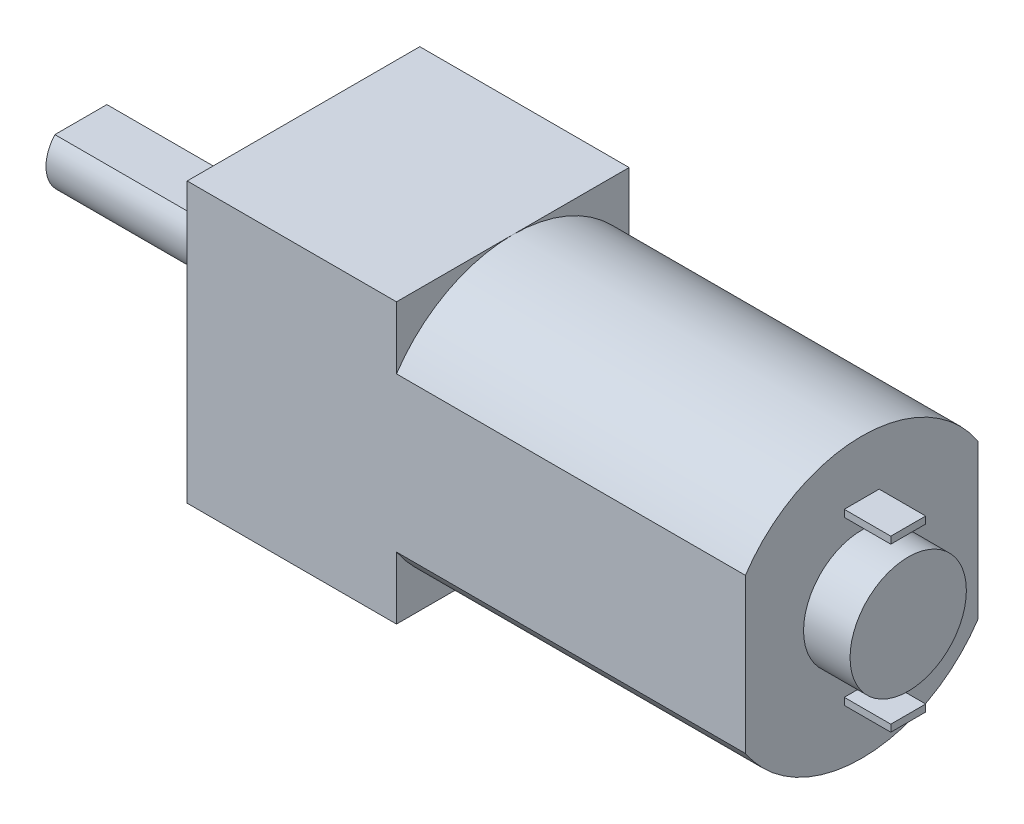
ISO-10303-21;
HEADER;
FILE_DESCRIPTION(('STEP AP214'),'2;1');
FILE_NAME('part.step','',(''),(''),'','','');
FILE_SCHEMA(('AUTOMOTIVE_DESIGN { 1 0 10303 214 1 1 1 1 }'));
ENDSEC;
DATA;
#1=APPLICATION_CONTEXT('core data for automotive mechanical design processes');
#2=APPLICATION_PROTOCOL_DEFINITION('international standard','automotive_design',2000,#1);
#3=PRODUCT_CONTEXT('',#1,'mechanical');
#4=PRODUCT('Part','Part','',(#3));
#5=PRODUCT_RELATED_PRODUCT_CATEGORY('part','',(#4));
#6=PRODUCT_DEFINITION_FORMATION('','',#4);
#7=PRODUCT_DEFINITION_CONTEXT('part definition',#1,'design');
#8=PRODUCT_DEFINITION('design','',#6,#7);
#9=PRODUCT_DEFINITION_SHAPE('','',#8);
#10=(LENGTH_UNIT() NAMED_UNIT(*) SI_UNIT(.MILLI.,.METRE.));
#11=(NAMED_UNIT(*) PLANE_ANGLE_UNIT() SI_UNIT($,.RADIAN.));
#12=(NAMED_UNIT(*) SI_UNIT($,.STERADIAN.) SOLID_ANGLE_UNIT());
#13=UNCERTAINTY_MEASURE_WITH_UNIT(LENGTH_MEASURE(1.E-05),#10,'distance_accuracy_value','');
#14=(GEOMETRIC_REPRESENTATION_CONTEXT(3) GLOBAL_UNCERTAINTY_ASSIGNED_CONTEXT((#13)) GLOBAL_UNIT_ASSIGNED_CONTEXT((#10,
#11,#12)) REPRESENTATION_CONTEXT('',''));
#15=CARTESIAN_POINT('',(0.,0.,0.));
#16=DIRECTION('',(0.,0.,1.));
#17=DIRECTION('',(1.,0.,0.));
#18=AXIS2_PLACEMENT_3D('',#15,#16,#17);
#19=CARTESIAN_POINT('',(15.,0.,0.));
#20=DIRECTION('',(-1.,0.,0.));
#21=DIRECTION('',(0.,0.,1.));
#22=AXIS2_PLACEMENT_3D('',#19,#20,#21);
#23=PLANE('',#22);
#24=DIRECTION('',(0.,1.,0.));
#25=VECTOR('',#24,1.);
#26=CARTESIAN_POINT('',(15.,-3.35,-0.750000000000003));
#27=LINE('',#26,#25);
#28=CARTESIAN_POINT('',(15.,-3.65,-0.750000000000003));
#29=VERTEX_POINT('',#28);
#30=CARTESIAN_POINT('',(15.,-3.35,-0.750000000000003));
#31=VERTEX_POINT('',#30);
#32=EDGE_CURVE('E181',#29,#31,#27,.T.);
#33=ORIENTED_EDGE('',*,*,#32,.F.);
#34=DIRECTION('',(0.,0.,-1.));
#35=VECTOR('',#34,1.);
#36=CARTESIAN_POINT('',(15.,-3.65,0.749999999999997));
#37=LINE('',#36,#35);
#38=CARTESIAN_POINT('',(15.,-3.65,0.749999999999997));
#39=VERTEX_POINT('',#38);
#40=EDGE_CURVE('E178',#39,#29,#37,.T.);
#41=ORIENTED_EDGE('',*,*,#40,.F.);
#42=DIRECTION('',(0.,-1.,0.));
#43=VECTOR('',#42,1.);
#44=CARTESIAN_POINT('',(15.,-3.35,0.749999999999997));
#45=LINE('',#44,#43);
#46=CARTESIAN_POINT('',(15.,-3.35,0.749999999999997));
#47=VERTEX_POINT('',#46);
#48=EDGE_CURVE('E50',#47,#39,#45,.T.);
#49=ORIENTED_EDGE('',*,*,#48,.F.);
#50=DIRECTION('',(0.,0.,1.));
#51=VECTOR('',#50,1.);
#52=CARTESIAN_POINT('',(15.,-3.35,0.749999999999997));
#53=LINE('',#52,#51);
#54=EDGE_CURVE('E45',#31,#47,#53,.T.);
#55=ORIENTED_EDGE('',*,*,#54,.F.);
#56=EDGE_LOOP('',(#33,#41,#49,#55));
#57=FACE_BOUND('',#56,.T.);
#58=CARTESIAN_POINT('',(15.,0.,0.));
#59=DIRECTION('',(-1.,0.,0.));
#60=DIRECTION('',(0.,0.,1.));
#61=AXIS2_PLACEMENT_3D('',#58,#59,#60);
#62=CIRCLE('',#61,6.);
#63=CARTESIAN_POINT('',(15.,-3.3166247903554,-5.));
#64=VERTEX_POINT('',#63);
#65=CARTESIAN_POINT('',(15.,-3.3166247903554,5.));
#66=VERTEX_POINT('',#65);
#67=EDGE_CURVE('E290',#64,#66,#62,.T.);
#68=ORIENTED_EDGE('',*,*,#67,.F.);
#69=DIRECTION('',(0.,1.,0.));
#70=VECTOR('',#69,1.);
#71=CARTESIAN_POINT('',(15.,-6.,-5.));
#72=LINE('',#71,#70);
#73=CARTESIAN_POINT('',(15.,3.3166247903554,-5.));
#74=VERTEX_POINT('',#73);
#75=EDGE_CURVE('E238',#64,#74,#72,.T.);
#76=ORIENTED_EDGE('',*,*,#75,.T.);
#77=CARTESIAN_POINT('',(15.,3.3166247903554,5.));
#78=VERTEX_POINT('',#77);
#79=EDGE_CURVE('E291',#78,#74,#62,.T.);
#80=ORIENTED_EDGE('',*,*,#79,.F.);
#81=DIRECTION('',(0.,-1.,0.));
#82=VECTOR('',#81,1.);
#83=CARTESIAN_POINT('',(15.,-6.,5.));
#84=LINE('',#83,#82);
#85=EDGE_CURVE('E245',#78,#66,#84,.T.);
#86=ORIENTED_EDGE('',*,*,#85,.T.);
#87=EDGE_LOOP('',(#68,#76,#80,#86));
#88=FACE_BOUND('',#87,.T.);
#89=DIRECTION('',(0.,1.,0.));
#90=VECTOR('',#89,1.);
#91=CARTESIAN_POINT('',(15.,3.65,-0.750000000000001));
#92=LINE('',#91,#90);
#93=CARTESIAN_POINT('',(15.,3.35,-0.750000000000001));
#94=VERTEX_POINT('',#93);
#95=CARTESIAN_POINT('',(15.,3.65,-0.750000000000001));
#96=VERTEX_POINT('',#95);
#97=EDGE_CURVE('E182',#94,#96,#92,.T.);
#98=ORIENTED_EDGE('',*,*,#97,.F.);
#99=DIRECTION('',(0.,0.,-1.));
#100=VECTOR('',#99,1.);
#101=CARTESIAN_POINT('',(15.,3.35,0.749999999999999));
#102=LINE('',#101,#100);
#103=CARTESIAN_POINT('',(15.,3.35,0.749999999999999));
#104=VERTEX_POINT('',#103);
#105=EDGE_CURVE('E195',#104,#94,#102,.T.);
#106=ORIENTED_EDGE('',*,*,#105,.F.);
#107=DIRECTION('',(0.,-1.,0.));
#108=VECTOR('',#107,1.);
#109=CARTESIAN_POINT('',(15.,3.65,0.749999999999999));
#110=LINE('',#109,#108);
#111=CARTESIAN_POINT('',(15.,3.65,0.749999999999999));
#112=VERTEX_POINT('',#111);
#113=EDGE_CURVE('E204',#112,#104,#110,.T.);
#114=ORIENTED_EDGE('',*,*,#113,.F.);
#115=DIRECTION('',(0.,0.,1.));
#116=VECTOR('',#115,1.);
#117=CARTESIAN_POINT('',(15.,3.65,0.749999999999999));
#118=LINE('',#117,#116);
#119=EDGE_CURVE('E185',#96,#112,#118,.T.);
#120=ORIENTED_EDGE('',*,*,#119,.F.);
#121=EDGE_LOOP('',(#98,#106,#114,#120));
#122=FACE_BOUND('',#121,.T.);
#123=CARTESIAN_POINT('',(15.,0.,0.));
#124=DIRECTION('',(-1.,0.,0.));
#125=DIRECTION('',(0.,0.,1.));
#126=AXIS2_PLACEMENT_3D('',#123,#124,#125);
#127=CIRCLE('',#126,2.5);
#128=CARTESIAN_POINT('',(15.,0.,2.5));
#129=VERTEX_POINT('',#128);
#130=EDGE_CURVE('E11',#129,#129,#127,.F.);
#131=ORIENTED_EDGE('',*,*,#130,.F.);
#132=EDGE_LOOP('',(#131));
#133=FACE_BOUND('',#132,.T.);
#134=ADVANCED_FACE('F30',(#57,#88,#122,#133),#23,.F.);
#135=CARTESIAN_POINT('',(-9.9,0.,0.));
#136=DIRECTION('',(-1.,0.,0.));
#137=DIRECTION('',(0.,0.,1.));
#138=AXIS2_PLACEMENT_3D('',#135,#136,#137);
#139=PLANE('',#138);
#140=CARTESIAN_POINT('',(-9.9,0.,0.));
#141=DIRECTION('',(-1.,0.,0.));
#142=DIRECTION('',(0.,0.,1.));
#143=AXIS2_PLACEMENT_3D('',#140,#141,#142);
#144=CIRCLE('',#143,1.95);
#145=CARTESIAN_POINT('',(-9.9,0.,1.95));
#146=VERTEX_POINT('',#145);
#147=EDGE_CURVE('E233',#146,#146,#144,.T.);
#148=ORIENTED_EDGE('',*,*,#147,.T.);
#149=EDGE_LOOP('',(#148));
#150=FACE_BOUND('',#149,.T.);
#151=CARTESIAN_POINT('',(-9.9,0.,0.));
#152=DIRECTION('',(-1.,0.,0.));
#153=DIRECTION('',(0.,0.,1.));
#154=AXIS2_PLACEMENT_3D('',#151,#152,#153);
#155=CIRCLE('',#154,1.5);
#156=CARTESIAN_POINT('',(-9.9,1.,-1.1180339887499));
#157=VERTEX_POINT('',#156);
#158=CARTESIAN_POINT('',(-9.9,1.,1.1180339887499));
#159=VERTEX_POINT('',#158);
#160=EDGE_CURVE('E229',#157,#159,#155,.T.);
#161=ORIENTED_EDGE('',*,*,#160,.F.);
#162=DIRECTION('',(0.,0.,1.));
#163=VECTOR('',#162,1.);
#164=CARTESIAN_POINT('',(-9.9,1.,-1.24599357943771));
#165=LINE('',#164,#163);
#166=EDGE_CURVE('E220',#157,#159,#165,.T.);
#167=ORIENTED_EDGE('',*,*,#166,.T.);
#168=EDGE_LOOP('',(#161,#167));
#169=FACE_BOUND('',#168,.T.);
#170=ADVANCED_FACE('F321',(#150,#169),#139,.T.);
#171=CARTESIAN_POINT('',(-9.,6.,5.));
#172=DIRECTION('',(1.,0.,0.));
#173=DIRECTION('',(0.,0.,-1.));
#174=AXIS2_PLACEMENT_3D('',#171,#172,#173);
#175=PLANE('',#174);
#176=DIRECTION('',(0.,1.,0.));
#177=VECTOR('',#176,1.);
#178=CARTESIAN_POINT('',(-9.,-6.,5.));
#179=LINE('',#178,#177);
#180=CARTESIAN_POINT('',(-9.,-6.,5.));
#181=VERTEX_POINT('',#180);
#182=CARTESIAN_POINT('',(-9.,6.,5.));
#183=VERTEX_POINT('',#182);
#184=EDGE_CURVE('E254',#181,#183,#179,.T.);
#185=ORIENTED_EDGE('',*,*,#184,.T.);
#186=DIRECTION('',(0.,0.,-1.));
#187=VECTOR('',#186,1.);
#188=CARTESIAN_POINT('',(-9.,6.,-5.));
#189=LINE('',#188,#187);
#190=CARTESIAN_POINT('',(-9.,6.,-5.));
#191=VERTEX_POINT('',#190);
#192=EDGE_CURVE('E257',#183,#191,#189,.T.);
#193=ORIENTED_EDGE('',*,*,#192,.T.);
#194=DIRECTION('',(0.,-1.,0.));
#195=VECTOR('',#194,1.);
#196=CARTESIAN_POINT('',(-9.,-6.,-5.));
#197=LINE('',#196,#195);
#198=CARTESIAN_POINT('',(-9.,-6.,-5.));
#199=VERTEX_POINT('',#198);
#200=EDGE_CURVE('E260',#191,#199,#197,.T.);
#201=ORIENTED_EDGE('',*,*,#200,.T.);
#202=DIRECTION('',(0.,0.,1.));
#203=VECTOR('',#202,1.);
#204=CARTESIAN_POINT('',(-9.,-6.,-5.));
#205=LINE('',#204,#203);
#206=EDGE_CURVE('E262',#199,#181,#205,.T.);
#207=ORIENTED_EDGE('',*,*,#206,.T.);
#208=EDGE_LOOP('',(#185,#193,#201,#207));
#209=FACE_BOUND('',#208,.T.);
#210=CARTESIAN_POINT('',(-9.,0.,0.));
#211=DIRECTION('',(1.,0.,0.));
#212=DIRECTION('',(0.,0.,-1.));
#213=AXIS2_PLACEMENT_3D('',#210,#211,#212);
#214=CIRCLE('',#213,1.95);
#215=CARTESIAN_POINT('',(-9.,0.,-1.95));
#216=VERTEX_POINT('',#215);
#217=EDGE_CURVE('E298',#216,#216,#214,.F.);
#218=ORIENTED_EDGE('',*,*,#217,.F.);
#219=EDGE_LOOP('',(#218));
#220=FACE_BOUND('',#219,.T.);
#221=ADVANCED_FACE('F325',(#209,#220),#175,.F.);
#222=CARTESIAN_POINT('',(0.,0.,0.));
#223=DIRECTION('',(-1.,0.,0.));
#224=DIRECTION('',(0.,0.,1.));
#225=AXIS2_PLACEMENT_3D('',#222,#223,#224);
#226=CYLINDRICAL_SURFACE('',#225,6.);
#227=DIRECTION('',(-1.,0.,0.));
#228=VECTOR('',#227,1.);
#229=CARTESIAN_POINT('',(0.,-3.3166247903554,-5.));
#230=LINE('',#229,#228);
#231=CARTESIAN_POINT('',(0.,-3.3166247903554,-5.));
#232=VERTEX_POINT('',#231);
#233=EDGE_CURVE('E241',#64,#232,#230,.T.);
#234=ORIENTED_EDGE('',*,*,#233,.F.);
#235=ORIENTED_EDGE('',*,*,#67,.T.);
#236=DIRECTION('',(-1.,0.,0.));
#237=VECTOR('',#236,1.);
#238=CARTESIAN_POINT('',(0.,-3.3166247903554,5.));
#239=LINE('',#238,#237);
#240=CARTESIAN_POINT('',(0.,-3.3166247903554,5.));
#241=VERTEX_POINT('',#240);
#242=EDGE_CURVE('E250',#241,#66,#239,.F.);
#243=ORIENTED_EDGE('',*,*,#242,.F.);
#244=CARTESIAN_POINT('',(0.,0.,0.));
#245=DIRECTION('',(-1.,0.,0.));
#246=DIRECTION('',(0.,0.,1.));
#247=AXIS2_PLACEMENT_3D('',#244,#245,#246);
#248=CIRCLE('',#247,6.);
#249=CARTESIAN_POINT('',(0.,-6.,0.));
#250=VERTEX_POINT('',#249);
#251=EDGE_CURVE('E294',#250,#241,#248,.T.);
#252=ORIENTED_EDGE('',*,*,#251,.F.);
#253=EDGE_CURVE('E622',#232,#250,#248,.T.);
#254=ORIENTED_EDGE('',*,*,#253,.F.);
#255=EDGE_LOOP('',(#234,#235,#243,#252,#254));
#256=FACE_BOUND('',#255,.T.);
#257=ADVANCED_FACE('F354',(#256),#226,.T.);
#258=DIRECTION('',(-1.,0.,0.));
#259=VECTOR('',#258,1.);
#260=CARTESIAN_POINT('',(0.,3.3166247903554,-5.));
#261=LINE('',#260,#259);
#262=CARTESIAN_POINT('',(0.,3.3166247903554,-5.));
#263=VERTEX_POINT('',#262);
#264=EDGE_CURVE('E243',#263,#74,#261,.F.);
#265=ORIENTED_EDGE('',*,*,#264,.F.);
#266=CARTESIAN_POINT('',(0.,6.,0.));
#267=VERTEX_POINT('',#266);
#268=EDGE_CURVE('E299',#267,#263,#248,.T.);
#269=ORIENTED_EDGE('',*,*,#268,.F.);
#270=CARTESIAN_POINT('',(0.,3.3166247903554,5.));
#271=VERTEX_POINT('',#270);
#272=EDGE_CURVE('E295',#271,#267,#248,.T.);
#273=ORIENTED_EDGE('',*,*,#272,.F.);
#274=DIRECTION('',(-1.,0.,0.));
#275=VECTOR('',#274,1.);
#276=CARTESIAN_POINT('',(0.,3.3166247903554,5.));
#277=LINE('',#276,#275);
#278=EDGE_CURVE('E248',#78,#271,#277,.T.);
#279=ORIENTED_EDGE('',*,*,#278,.F.);
#280=ORIENTED_EDGE('',*,*,#79,.T.);
#281=EDGE_LOOP('',(#265,#269,#273,#279,#280));
#282=FACE_BOUND('',#281,.T.);
#283=ADVANCED_FACE('F32',(#282),#226,.T.);
#284=CARTESIAN_POINT('',(0.,6.,5.));
#285=DIRECTION('',(1.,0.,0.));
#286=DIRECTION('',(0.,0.,-1.));
#287=AXIS2_PLACEMENT_3D('',#284,#285,#286);
#288=PLANE('',#287);
#289=DIRECTION('',(0.,1.,0.));
#290=VECTOR('',#289,1.);
#291=CARTESIAN_POINT('',(0.,-6.,5.));
#292=LINE('',#291,#290);
#293=CARTESIAN_POINT('',(0.,6.,5.));
#294=VERTEX_POINT('',#293);
#295=EDGE_CURVE('E253',#271,#294,#292,.T.);
#296=ORIENTED_EDGE('',*,*,#295,.F.);
#297=ORIENTED_EDGE('',*,*,#272,.T.);
#298=DIRECTION('',(0.,0.,-1.));
#299=VECTOR('',#298,1.);
#300=CARTESIAN_POINT('',(0.,6.,-5.));
#301=LINE('',#300,#299);
#302=EDGE_CURVE('E269',#294,#267,#301,.T.);
#303=ORIENTED_EDGE('',*,*,#302,.F.);
#304=EDGE_LOOP('',(#296,#297,#303));
#305=FACE_BOUND('',#304,.T.);
#306=ADVANCED_FACE('F351',(#305),#288,.T.);
#307=CARTESIAN_POINT('',(0.,6.,-5.));
#308=VERTEX_POINT('',#307);
#309=EDGE_CURVE('E268',#267,#308,#301,.T.);
#310=ORIENTED_EDGE('',*,*,#309,.F.);
#311=ORIENTED_EDGE('',*,*,#268,.T.);
#312=DIRECTION('',(0.,-1.,0.));
#313=VECTOR('',#312,1.);
#314=CARTESIAN_POINT('',(0.,-6.,-5.));
#315=LINE('',#314,#313);
#316=EDGE_CURVE('E273',#308,#263,#315,.T.);
#317=ORIENTED_EDGE('',*,*,#316,.F.);
#318=EDGE_LOOP('',(#310,#311,#317));
#319=FACE_BOUND('',#318,.T.);
#320=ADVANCED_FACE('F569',(#319),#288,.T.);
#321=CARTESIAN_POINT('',(0.,-6.,-5.));
#322=VERTEX_POINT('',#321);
#323=EDGE_CURVE('E272',#232,#322,#315,.T.);
#324=ORIENTED_EDGE('',*,*,#323,.F.);
#325=ORIENTED_EDGE('',*,*,#253,.T.);
#326=DIRECTION('',(0.,0.,1.));
#327=VECTOR('',#326,1.);
#328=CARTESIAN_POINT('',(0.,-6.,-5.));
#329=LINE('',#328,#327);
#330=EDGE_CURVE('E258',#322,#250,#329,.T.);
#331=ORIENTED_EDGE('',*,*,#330,.F.);
#332=EDGE_LOOP('',(#324,#325,#331));
#333=FACE_BOUND('',#332,.T.);
#334=ADVANCED_FACE('F334',(#333),#288,.T.);
#335=CARTESIAN_POINT('',(-9.,-6.,5.));
#336=DIRECTION('',(0.,0.,-1.));
#337=DIRECTION('',(-1.,0.,0.));
#338=AXIS2_PLACEMENT_3D('',#335,#336,#337);
#339=PLANE('',#338);
#340=CARTESIAN_POINT('',(0.,-6.,5.));
#341=VERTEX_POINT('',#340);
#342=EDGE_CURVE('E265',#341,#241,#292,.T.);
#343=ORIENTED_EDGE('',*,*,#342,.T.);
#344=ORIENTED_EDGE('',*,*,#242,.T.);
#345=ORIENTED_EDGE('',*,*,#85,.F.);
#346=ORIENTED_EDGE('',*,*,#278,.T.);
#347=ORIENTED_EDGE('',*,*,#295,.T.);
#348=DIRECTION('',(1.,0.,0.));
#349=VECTOR('',#348,1.);
#350=CARTESIAN_POINT('',(-9.,6.,5.));
#351=LINE('',#350,#349);
#352=EDGE_CURVE('E287',#183,#294,#351,.T.);
#353=ORIENTED_EDGE('',*,*,#352,.F.);
#354=ORIENTED_EDGE('',*,*,#184,.F.);
#355=DIRECTION('',(1.,0.,0.));
#356=VECTOR('',#355,1.);
#357=CARTESIAN_POINT('',(-9.,-6.,5.));
#358=LINE('',#357,#356);
#359=EDGE_CURVE('E264',#181,#341,#358,.T.);
#360=ORIENTED_EDGE('',*,*,#359,.T.);
#361=EDGE_LOOP('',(#343,#344,#345,#346,#347,#353,#354,#360));
#362=FACE_BOUND('',#361,.T.);
#363=ADVANCED_FACE('F330',(#362),#339,.F.);
#364=CARTESIAN_POINT('',(-9.,6.,-5.));
#365=DIRECTION('',(0.,-1.,0.));
#366=DIRECTION('',(0.,0.,-1.));
#367=AXIS2_PLACEMENT_3D('',#364,#365,#366);
#368=PLANE('',#367);
#369=ORIENTED_EDGE('',*,*,#302,.T.);
#370=ORIENTED_EDGE('',*,*,#309,.T.);
#371=DIRECTION('',(1.,0.,0.));
#372=VECTOR('',#371,1.);
#373=CARTESIAN_POINT('',(-9.,6.,-5.));
#374=LINE('',#373,#372);
#375=EDGE_CURVE('E284',#191,#308,#374,.T.);
#376=ORIENTED_EDGE('',*,*,#375,.F.);
#377=ORIENTED_EDGE('',*,*,#192,.F.);
#378=ORIENTED_EDGE('',*,*,#352,.T.);
#379=EDGE_LOOP('',(#369,#370,#376,#377,#378));
#380=FACE_BOUND('',#379,.T.);
#381=ADVANCED_FACE('F333',(#380),#368,.F.);
#382=CARTESIAN_POINT('',(-9.,-6.,-5.));
#383=DIRECTION('',(0.,0.,1.));
#384=DIRECTION('',(1.,0.,0.));
#385=AXIS2_PLACEMENT_3D('',#382,#383,#384);
#386=PLANE('',#385);
#387=ORIENTED_EDGE('',*,*,#316,.T.);
#388=ORIENTED_EDGE('',*,*,#264,.T.);
#389=ORIENTED_EDGE('',*,*,#75,.F.);
#390=ORIENTED_EDGE('',*,*,#233,.T.);
#391=ORIENTED_EDGE('',*,*,#323,.T.);
#392=DIRECTION('',(1.,0.,0.));
#393=VECTOR('',#392,1.);
#394=CARTESIAN_POINT('',(-9.,-6.,-5.));
#395=LINE('',#394,#393);
#396=EDGE_CURVE('E281',#199,#322,#395,.T.);
#397=ORIENTED_EDGE('',*,*,#396,.F.);
#398=ORIENTED_EDGE('',*,*,#200,.F.);
#399=ORIENTED_EDGE('',*,*,#375,.T.);
#400=EDGE_LOOP('',(#387,#388,#389,#390,#391,#397,#398,#399));
#401=FACE_BOUND('',#400,.T.);
#402=ADVANCED_FACE('F338',(#401),#386,.F.);
#403=CARTESIAN_POINT('',(-9.,-6.,-5.));
#404=DIRECTION('',(0.,1.,0.));
#405=DIRECTION('',(0.,0.,1.));
#406=AXIS2_PLACEMENT_3D('',#403,#404,#405);
#407=PLANE('',#406);
#408=ORIENTED_EDGE('',*,*,#330,.T.);
#409=EDGE_CURVE('E276',#250,#341,#329,.T.);
#410=ORIENTED_EDGE('',*,*,#409,.T.);
#411=ORIENTED_EDGE('',*,*,#359,.F.);
#412=ORIENTED_EDGE('',*,*,#206,.F.);
#413=ORIENTED_EDGE('',*,*,#396,.T.);
#414=EDGE_LOOP('',(#408,#410,#411,#412,#413));
#415=FACE_BOUND('',#414,.T.);
#416=ADVANCED_FACE('F342',(#415),#407,.F.);
#417=ORIENTED_EDGE('',*,*,#409,.F.);
#418=ORIENTED_EDGE('',*,*,#251,.T.);
#419=ORIENTED_EDGE('',*,*,#342,.F.);
#420=EDGE_LOOP('',(#417,#418,#419));
#421=FACE_BOUND('',#420,.T.);
#422=ADVANCED_FACE('F346',(#421),#288,.T.);
#423=CARTESIAN_POINT('',(-9.9,0.,0.));
#424=DIRECTION('',(1.,0.,0.));
#425=DIRECTION('',(0.,0.,-1.));
#426=AXIS2_PLACEMENT_3D('',#423,#424,#425);
#427=CYLINDRICAL_SURFACE('',#426,1.95);
#428=ORIENTED_EDGE('',*,*,#147,.F.);
#429=EDGE_LOOP('',(#428));
#430=FACE_BOUND('',#429,.T.);
#431=ORIENTED_EDGE('',*,*,#217,.T.);
#432=EDGE_LOOP('',(#431));
#433=FACE_BOUND('',#432,.T.);
#434=ADVANCED_FACE('F318',(#430,#433),#427,.T.);
#435=CARTESIAN_POINT('',(-18.57,0.,0.));
#436=DIRECTION('',(1.,0.,0.));
#437=DIRECTION('',(0.,0.,-1.));
#438=AXIS2_PLACEMENT_3D('',#435,#436,#437);
#439=CYLINDRICAL_SURFACE('',#438,1.5);
#440=CARTESIAN_POINT('',(-18.57,0.,0.));
#441=DIRECTION('',(-1.,0.,0.));
#442=DIRECTION('',(0.,0.,1.));
#443=AXIS2_PLACEMENT_3D('',#440,#441,#442);
#444=CIRCLE('',#443,1.5);
#445=CARTESIAN_POINT('',(-18.57,1.,-1.1180339887499));
#446=VERTEX_POINT('',#445);
#447=CARTESIAN_POINT('',(-18.57,1.,1.1180339887499));
#448=VERTEX_POINT('',#447);
#449=EDGE_CURVE('E230',#446,#448,#444,.T.);
#450=ORIENTED_EDGE('',*,*,#449,.F.);
#451=DIRECTION('',(1.,0.,0.));
#452=VECTOR('',#451,1.);
#453=CARTESIAN_POINT('',(-18.57,1.,-1.1180339887499));
#454=LINE('',#453,#452);
#455=EDGE_CURVE('E226',#446,#157,#454,.T.);
#456=ORIENTED_EDGE('',*,*,#455,.T.);
#457=ORIENTED_EDGE('',*,*,#160,.T.);
#458=DIRECTION('',(1.,0.,0.));
#459=VECTOR('',#458,1.);
#460=CARTESIAN_POINT('',(-18.57,1.,1.1180339887499));
#461=LINE('',#460,#459);
#462=EDGE_CURVE('E223',#159,#448,#461,.F.);
#463=ORIENTED_EDGE('',*,*,#462,.T.);
#464=EDGE_LOOP('',(#450,#456,#457,#463));
#465=FACE_BOUND('',#464,.T.);
#466=ADVANCED_FACE('F307',(#465),#439,.T.);
#467=CARTESIAN_POINT('',(-18.57,0.,0.));
#468=DIRECTION('',(-1.,0.,0.));
#469=DIRECTION('',(0.,0.,1.));
#470=AXIS2_PLACEMENT_3D('',#467,#468,#469);
#471=PLANE('',#470);
#472=DIRECTION('',(0.,0.,1.));
#473=VECTOR('',#472,1.);
#474=CARTESIAN_POINT('',(-18.57,1.,0.));
#475=LINE('',#474,#473);
#476=EDGE_CURVE('E38',#446,#448,#475,.T.);
#477=ORIENTED_EDGE('',*,*,#476,.F.);
#478=ORIENTED_EDGE('',*,*,#449,.T.);
#479=EDGE_LOOP('',(#477,#478));
#480=FACE_BOUND('',#479,.T.);
#481=ADVANCED_FACE('F309',(#480),#471,.T.);
#482=CARTESIAN_POINT('',(-9.9,1.,-1.24599357943771));
#483=DIRECTION('',(0.,-1.,0.));
#484=DIRECTION('',(0.,0.,-1.));
#485=AXIS2_PLACEMENT_3D('',#482,#483,#484);
#486=PLANE('',#485);
#487=ORIENTED_EDGE('',*,*,#476,.T.);
#488=ORIENTED_EDGE('',*,*,#462,.F.);
#489=ORIENTED_EDGE('',*,*,#166,.F.);
#490=ORIENTED_EDGE('',*,*,#455,.F.);
#491=EDGE_LOOP('',(#487,#488,#489,#490));
#492=FACE_BOUND('',#491,.T.);
#493=ADVANCED_FACE('F303',(#492),#486,.F.);
#494=CARTESIAN_POINT('',(17.,3.65,-0.750000000000001));
#495=DIRECTION('',(0.,0.,1.));
#496=DIRECTION('',(0.,-1.,0.));
#497=AXIS2_PLACEMENT_3D('',#494,#495,#496);
#498=PLANE('',#497);
#499=ORIENTED_EDGE('',*,*,#97,.T.);
#500=DIRECTION('',(-1.,0.,0.));
#501=VECTOR('',#500,1.);
#502=CARTESIAN_POINT('',(17.,3.65,-0.750000000000001));
#503=LINE('',#502,#501);
#504=CARTESIAN_POINT('',(17.,3.65,-0.750000000000001));
#505=VERTEX_POINT('',#504);
#506=EDGE_CURVE('E217',#505,#96,#503,.T.);
#507=ORIENTED_EDGE('',*,*,#506,.F.);
#508=DIRECTION('',(0.,1.,0.));
#509=VECTOR('',#508,1.);
#510=CARTESIAN_POINT('',(17.,3.65,-0.750000000000001));
#511=LINE('',#510,#509);
#512=CARTESIAN_POINT('',(17.,3.35,-0.750000000000001));
#513=VERTEX_POINT('',#512);
#514=EDGE_CURVE('E191',#513,#505,#511,.T.);
#515=ORIENTED_EDGE('',*,*,#514,.F.);
#516=DIRECTION('',(-1.,0.,0.));
#517=VECTOR('',#516,1.);
#518=CARTESIAN_POINT('',(17.,3.35,-0.750000000000001));
#519=LINE('',#518,#517);
#520=EDGE_CURVE('E200',#513,#94,#519,.T.);
#521=ORIENTED_EDGE('',*,*,#520,.T.);
#522=EDGE_LOOP('',(#499,#507,#515,#521));
#523=FACE_BOUND('',#522,.T.);
#524=ADVANCED_FACE('F316',(#523),#498,.F.);
#525=CARTESIAN_POINT('',(17.,3.65,0.749999999999999));
#526=DIRECTION('',(0.,-1.,0.));
#527=DIRECTION('',(0.,0.,-1.));
#528=AXIS2_PLACEMENT_3D('',#525,#526,#527);
#529=PLANE('',#528);
#530=ORIENTED_EDGE('',*,*,#119,.T.);
#531=DIRECTION('',(-1.,0.,0.));
#532=VECTOR('',#531,1.);
#533=CARTESIAN_POINT('',(17.,3.65,0.749999999999999));
#534=LINE('',#533,#532);
#535=CARTESIAN_POINT('',(17.,3.65,0.749999999999999));
#536=VERTEX_POINT('',#535);
#537=EDGE_CURVE('E214',#536,#112,#534,.T.);
#538=ORIENTED_EDGE('',*,*,#537,.F.);
#539=DIRECTION('',(0.,0.,1.));
#540=VECTOR('',#539,1.);
#541=CARTESIAN_POINT('',(17.,3.65,0.749999999999999));
#542=LINE('',#541,#540);
#543=EDGE_CURVE('E194',#505,#536,#542,.T.);
#544=ORIENTED_EDGE('',*,*,#543,.F.);
#545=ORIENTED_EDGE('',*,*,#506,.T.);
#546=EDGE_LOOP('',(#530,#538,#544,#545));
#547=FACE_BOUND('',#546,.T.);
#548=ADVANCED_FACE('F397',(#547),#529,.F.);
#549=CARTESIAN_POINT('',(17.,3.65,0.749999999999999));
#550=DIRECTION('',(0.,0.,-1.));
#551=DIRECTION('',(0.,1.,0.));
#552=AXIS2_PLACEMENT_3D('',#549,#550,#551);
#553=PLANE('',#552);
#554=ORIENTED_EDGE('',*,*,#113,.T.);
#555=DIRECTION('',(-1.,0.,0.));
#556=VECTOR('',#555,1.);
#557=CARTESIAN_POINT('',(17.,3.35,0.749999999999999));
#558=LINE('',#557,#556);
#559=CARTESIAN_POINT('',(17.,3.35,0.749999999999999));
#560=VERTEX_POINT('',#559);
#561=EDGE_CURVE('E211',#560,#104,#558,.T.);
#562=ORIENTED_EDGE('',*,*,#561,.F.);
#563=DIRECTION('',(0.,-1.,0.));
#564=VECTOR('',#563,1.);
#565=CARTESIAN_POINT('',(17.,3.65,0.749999999999999));
#566=LINE('',#565,#564);
#567=EDGE_CURVE('E197',#536,#560,#566,.T.);
#568=ORIENTED_EDGE('',*,*,#567,.F.);
#569=ORIENTED_EDGE('',*,*,#537,.T.);
#570=EDGE_LOOP('',(#554,#562,#568,#569));
#571=FACE_BOUND('',#570,.T.);
#572=ADVANCED_FACE('F407',(#571),#553,.F.);
#573=CARTESIAN_POINT('',(17.,3.35,0.749999999999999));
#574=DIRECTION('',(0.,1.,0.));
#575=DIRECTION('',(0.,0.,1.));
#576=AXIS2_PLACEMENT_3D('',#573,#574,#575);
#577=PLANE('',#576);
#578=ORIENTED_EDGE('',*,*,#105,.T.);
#579=ORIENTED_EDGE('',*,*,#520,.F.);
#580=DIRECTION('',(0.,0.,-1.));
#581=VECTOR('',#580,1.);
#582=CARTESIAN_POINT('',(17.,3.35,0.749999999999999));
#583=LINE('',#582,#581);
#584=EDGE_CURVE('E199',#560,#513,#583,.T.);
#585=ORIENTED_EDGE('',*,*,#584,.F.);
#586=ORIENTED_EDGE('',*,*,#561,.T.);
#587=EDGE_LOOP('',(#578,#579,#585,#586));
#588=FACE_BOUND('',#587,.T.);
#589=ADVANCED_FACE('F417',(#588),#577,.F.);
#590=CARTESIAN_POINT('',(17.,3.35,-0.750000000000001));
#591=DIRECTION('',(1.,0.,0.));
#592=DIRECTION('',(0.,0.,-1.));
#593=AXIS2_PLACEMENT_3D('',#590,#591,#592);
#594=PLANE('',#593);
#595=ORIENTED_EDGE('',*,*,#514,.T.);
#596=ORIENTED_EDGE('',*,*,#543,.T.);
#597=ORIENTED_EDGE('',*,*,#567,.T.);
#598=ORIENTED_EDGE('',*,*,#584,.T.);
#599=EDGE_LOOP('',(#595,#596,#597,#598));
#600=FACE_BOUND('',#599,.T.);
#601=ADVANCED_FACE('F427',(#600),#594,.T.);
#602=CARTESIAN_POINT('',(17.,-3.35,-0.750000000000003));
#603=DIRECTION('',(0.,0.,1.));
#604=DIRECTION('',(0.,-1.,0.));
#605=AXIS2_PLACEMENT_3D('',#602,#603,#604);
#606=PLANE('',#605);
#607=ORIENTED_EDGE('',*,*,#32,.T.);
#608=DIRECTION('',(-1.,0.,0.));
#609=VECTOR('',#608,1.);
#610=CARTESIAN_POINT('',(17.,-3.35,-0.750000000000003));
#611=LINE('',#610,#609);
#612=CARTESIAN_POINT('',(17.,-3.35,-0.750000000000003));
#613=VERTEX_POINT('',#612);
#614=EDGE_CURVE('E162',#613,#31,#611,.T.);
#615=ORIENTED_EDGE('',*,*,#614,.F.);
#616=DIRECTION('',(0.,1.,0.));
#617=VECTOR('',#616,1.);
#618=CARTESIAN_POINT('',(17.,-3.35,-0.750000000000003));
#619=LINE('',#618,#617);
#620=CARTESIAN_POINT('',(17.,-3.65,-0.750000000000003));
#621=VERTEX_POINT('',#620);
#622=EDGE_CURVE('E169',#621,#613,#619,.T.);
#623=ORIENTED_EDGE('',*,*,#622,.F.);
#624=DIRECTION('',(-1.,0.,0.));
#625=VECTOR('',#624,1.);
#626=CARTESIAN_POINT('',(17.,-3.65,-0.750000000000003));
#627=LINE('',#626,#625);
#628=EDGE_CURVE('E512',#621,#29,#627,.T.);
#629=ORIENTED_EDGE('',*,*,#628,.T.);
#630=EDGE_LOOP('',(#607,#615,#623,#629));
#631=FACE_BOUND('',#630,.T.);
#632=ADVANCED_FACE('F180',(#631),#606,.F.);
#633=CARTESIAN_POINT('',(17.,-3.35,0.749999999999997));
#634=DIRECTION('',(0.,-1.,0.));
#635=DIRECTION('',(0.,0.,-1.));
#636=AXIS2_PLACEMENT_3D('',#633,#634,#635);
#637=PLANE('',#636);
#638=ORIENTED_EDGE('',*,*,#54,.T.);
#639=DIRECTION('',(-1.,0.,0.));
#640=VECTOR('',#639,1.);
#641=CARTESIAN_POINT('',(17.,-3.35,0.749999999999997));
#642=LINE('',#641,#640);
#643=CARTESIAN_POINT('',(17.,-3.35,0.749999999999997));
#644=VERTEX_POINT('',#643);
#645=EDGE_CURVE('E165',#644,#47,#642,.T.);
#646=ORIENTED_EDGE('',*,*,#645,.F.);
#647=DIRECTION('',(0.,0.,1.));
#648=VECTOR('',#647,1.);
#649=CARTESIAN_POINT('',(17.,-3.35,0.749999999999997));
#650=LINE('',#649,#648);
#651=EDGE_CURVE('E158',#613,#644,#650,.T.);
#652=ORIENTED_EDGE('',*,*,#651,.F.);
#653=ORIENTED_EDGE('',*,*,#614,.T.);
#654=EDGE_LOOP('',(#638,#646,#652,#653));
#655=FACE_BOUND('',#654,.T.);
#656=ADVANCED_FACE('F160',(#655),#637,.F.);
#657=CARTESIAN_POINT('',(17.,-3.35,0.749999999999997));
#658=DIRECTION('',(0.,0.,-1.));
#659=DIRECTION('',(-1.,0.,0.));
#660=AXIS2_PLACEMENT_3D('',#657,#658,#659);
#661=PLANE('',#660);
#662=ORIENTED_EDGE('',*,*,#48,.T.);
#663=DIRECTION('',(-1.,0.,0.));
#664=VECTOR('',#663,1.);
#665=CARTESIAN_POINT('',(17.,-3.65,0.749999999999997));
#666=LINE('',#665,#664);
#667=CARTESIAN_POINT('',(17.,-3.65,0.749999999999997));
#668=VERTEX_POINT('',#667);
#669=EDGE_CURVE('E187',#668,#39,#666,.T.);
#670=ORIENTED_EDGE('',*,*,#669,.F.);
#671=DIRECTION('',(0.,-1.,0.));
#672=VECTOR('',#671,1.);
#673=CARTESIAN_POINT('',(17.,-3.35,0.749999999999997));
#674=LINE('',#673,#672);
#675=EDGE_CURVE('E168',#644,#668,#674,.T.);
#676=ORIENTED_EDGE('',*,*,#675,.F.);
#677=ORIENTED_EDGE('',*,*,#645,.T.);
#678=EDGE_LOOP('',(#662,#670,#676,#677));
#679=FACE_BOUND('',#678,.T.);
#680=ADVANCED_FACE('F454',(#679),#661,.F.);
#681=CARTESIAN_POINT('',(17.,-3.65,0.749999999999997));
#682=DIRECTION('',(0.,1.,0.));
#683=DIRECTION('',(0.,0.,1.));
#684=AXIS2_PLACEMENT_3D('',#681,#682,#683);
#685=PLANE('',#684);
#686=ORIENTED_EDGE('',*,*,#40,.T.);
#687=ORIENTED_EDGE('',*,*,#628,.F.);
#688=DIRECTION('',(0.,0.,-1.));
#689=VECTOR('',#688,1.);
#690=CARTESIAN_POINT('',(17.,-3.65,0.749999999999997));
#691=LINE('',#690,#689);
#692=EDGE_CURVE('E174',#668,#621,#691,.T.);
#693=ORIENTED_EDGE('',*,*,#692,.F.);
#694=ORIENTED_EDGE('',*,*,#669,.T.);
#695=EDGE_LOOP('',(#686,#687,#693,#694));
#696=FACE_BOUND('',#695,.T.);
#697=ADVANCED_FACE('F463',(#696),#685,.F.);
#698=CARTESIAN_POINT('',(17.,-3.65,-0.750000000000003));
#699=DIRECTION('',(1.,0.,0.));
#700=DIRECTION('',(0.,0.,-1.));
#701=AXIS2_PLACEMENT_3D('',#698,#699,#700);
#702=PLANE('',#701);
#703=ORIENTED_EDGE('',*,*,#622,.T.);
#704=ORIENTED_EDGE('',*,*,#651,.T.);
#705=ORIENTED_EDGE('',*,*,#675,.T.);
#706=ORIENTED_EDGE('',*,*,#692,.T.);
#707=EDGE_LOOP('',(#703,#704,#705,#706));
#708=FACE_BOUND('',#707,.T.);
#709=ADVANCED_FACE('F172',(#708),#702,.T.);
#710=CARTESIAN_POINT('',(17.,0.,0.));
#711=DIRECTION('',(-1.,0.,0.));
#712=DIRECTION('',(0.,0.,1.));
#713=AXIS2_PLACEMENT_3D('',#710,#711,#712);
#714=CYLINDRICAL_SURFACE('',#713,2.5);
#715=CARTESIAN_POINT('',(17.,0.,0.));
#716=DIRECTION('',(1.,0.,0.));
#717=DIRECTION('',(0.,0.,-1.));
#718=AXIS2_PLACEMENT_3D('',#715,#716,#717);
#719=CIRCLE('',#718,2.5);
#720=CARTESIAN_POINT('',(17.,0.,-2.5));
#721=VERTEX_POINT('',#720);
#722=EDGE_CURVE('E507',#721,#721,#719,.T.);
#723=ORIENTED_EDGE('',*,*,#722,.F.);
#724=EDGE_LOOP('',(#723));
#725=FACE_BOUND('',#724,.T.);
#726=ORIENTED_EDGE('',*,*,#130,.T.);
#727=EDGE_LOOP('',(#726));
#728=FACE_BOUND('',#727,.T.);
#729=ADVANCED_FACE('F482',(#725,#728),#714,.T.);
#730=CARTESIAN_POINT('',(17.,0.,0.));
#731=DIRECTION('',(1.,0.,0.));
#732=DIRECTION('',(0.,0.,-1.));
#733=AXIS2_PLACEMENT_3D('',#730,#731,#732);
#734=PLANE('',#733);
#735=ORIENTED_EDGE('',*,*,#722,.T.);
#736=EDGE_LOOP('',(#735));
#737=FACE_BOUND('',#736,.T.);
#738=ADVANCED_FACE('F491',(#737),#734,.T.);
#739=CLOSED_SHELL('',(#134,#170,#221,#257,#283,#306,#320,#334,#363,#381,#402,#416,#422,#434,
#466,#481,#493,#524,#548,#572,#589,#601,#632,#656,#680,#697,#709,#729,#738));
#740=MANIFOLD_SOLID_BREP('B2',#739);
#741=ADVANCED_BREP_SHAPE_REPRESENTATION('',(#18,#740),#14);
#742=SHAPE_DEFINITION_REPRESENTATION(#9,#741);
ENDSEC;
END-ISO-10303-21;
